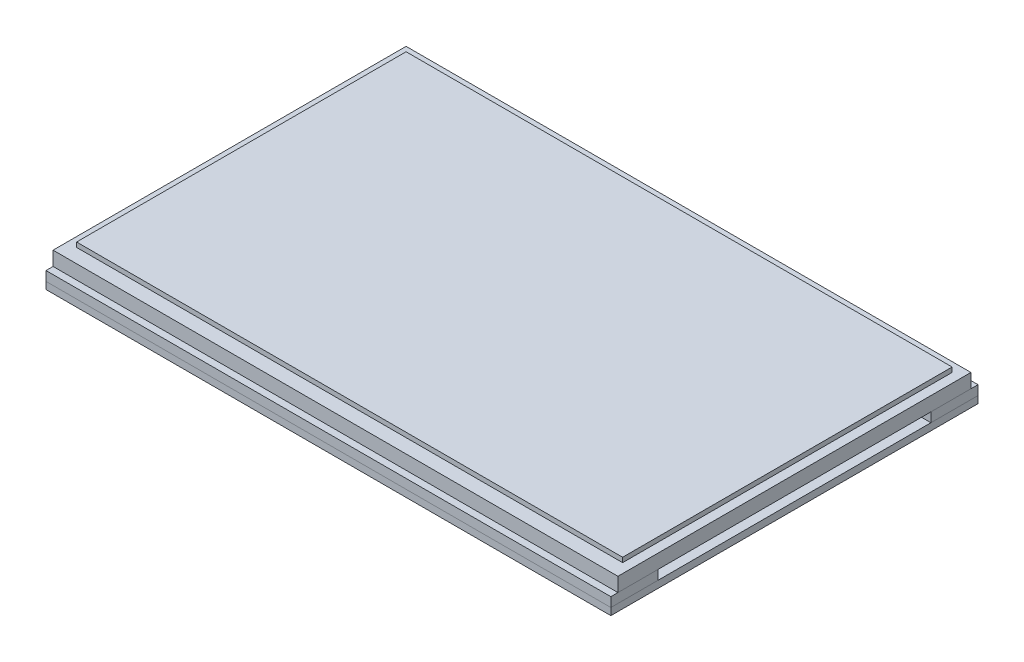
ISO-10303-21;
HEADER;
FILE_DESCRIPTION(('STEP AP214'),'2;1');
FILE_NAME('part.step','',(''),(''),'','','');
FILE_SCHEMA(('AUTOMOTIVE_DESIGN { 1 0 10303 214 1 1 1 1 }'));
ENDSEC;
DATA;
#1=APPLICATION_CONTEXT('core data for automotive mechanical design processes');
#2=APPLICATION_PROTOCOL_DEFINITION('international standard','automotive_design',2000,#1);
#3=PRODUCT_CONTEXT('',#1,'mechanical');
#4=PRODUCT('Part','Part','',(#3));
#5=PRODUCT_RELATED_PRODUCT_CATEGORY('part','',(#4));
#6=PRODUCT_DEFINITION_FORMATION('','',#4);
#7=PRODUCT_DEFINITION_CONTEXT('part definition',#1,'design');
#8=PRODUCT_DEFINITION('design','',#6,#7);
#9=PRODUCT_DEFINITION_SHAPE('','',#8);
#10=(LENGTH_UNIT() NAMED_UNIT(*) SI_UNIT(.MILLI.,.METRE.));
#11=(NAMED_UNIT(*) PLANE_ANGLE_UNIT() SI_UNIT($,.RADIAN.));
#12=(NAMED_UNIT(*) SI_UNIT($,.STERADIAN.) SOLID_ANGLE_UNIT());
#13=UNCERTAINTY_MEASURE_WITH_UNIT(LENGTH_MEASURE(1.E-05),#10,'distance_accuracy_value','');
#14=(GEOMETRIC_REPRESENTATION_CONTEXT(3) GLOBAL_UNCERTAINTY_ASSIGNED_CONTEXT((#13)) GLOBAL_UNIT_ASSIGNED_CONTEXT((#10,
#11,#12)) REPRESENTATION_CONTEXT('',''));
#15=CARTESIAN_POINT('',(0.,0.,0.));
#16=DIRECTION('',(0.,0.,1.));
#17=DIRECTION('',(1.,0.,0.));
#18=AXIS2_PLACEMENT_3D('',#15,#16,#17);
#19=CARTESIAN_POINT('',(-8.87339826388611,54.1494730588934,67.3928000621272));
#20=DIRECTION('',(1.,0.,0.));
#21=DIRECTION('',(0.,0.,-1.));
#22=AXIS2_PLACEMENT_3D('',#19,#20,#21);
#23=PLANE('',#22);
#24=DIRECTION('',(0.,0.,1.));
#25=VECTOR('',#24,1.);
#26=CARTESIAN_POINT('',(-8.87339826388611,52.1494730588934,67.3928000621272));
#27=LINE('',#26,#25);
#28=CARTESIAN_POINT('',(-8.87339826388611,52.1494730588934,57.3928000621272));
#29=VERTEX_POINT('',#28);
#30=CARTESIAN_POINT('',(-8.87339826388611,52.1494730588934,67.3928000621272));
#31=VERTEX_POINT('',#30);
#32=EDGE_CURVE('P0_E80',#29,#31,#27,.T.);
#33=ORIENTED_EDGE('',*,*,#32,.T.);
#34=DIRECTION('',(0.,-1.,0.));
#35=VECTOR('',#34,1.);
#36=CARTESIAN_POINT('',(-8.87339826388611,54.1494730588934,67.3928000621272));
#37=LINE('',#36,#35);
#38=CARTESIAN_POINT('',(-8.87339826388611,54.1494730588934,67.3928000621272));
#39=VERTEX_POINT('',#38);
#40=EDGE_CURVE('P0_E11',#39,#31,#37,.T.);
#41=ORIENTED_EDGE('',*,*,#40,.F.);
#42=DIRECTION('',(0.,0.,1.));
#43=VECTOR('',#42,1.);
#44=CARTESIAN_POINT('',(-8.87339826388611,54.1494730588934,67.3928000621272));
#45=LINE('',#44,#43);
#46=CARTESIAN_POINT('',(-8.87339826388611,54.1494730588934,57.3928000621272));
#47=VERTEX_POINT('',#46);
#48=EDGE_CURVE('P0_E68',#47,#39,#45,.T.);
#49=ORIENTED_EDGE('',*,*,#48,.F.);
#50=DIRECTION('',(0.,-1.,0.));
#51=VECTOR('',#50,1.);
#52=CARTESIAN_POINT('',(-8.87339826388611,54.1494730588934,57.3928000621272));
#53=LINE('',#52,#51);
#54=EDGE_CURVE('P0_E76',#47,#29,#53,.T.);
#55=ORIENTED_EDGE('',*,*,#54,.T.);
#56=EDGE_LOOP('',(#33,#41,#49,#55));
#57=FACE_BOUND('',#56,.T.);
#58=ADVANCED_FACE('P0_F17',(#57),#23,.F.);
#59=CARTESIAN_POINT('',(-8.87339826388611,54.1494730588934,67.3928000621272));
#60=DIRECTION('',(0.,0.,-1.));
#61=DIRECTION('',(-1.,0.,0.));
#62=AXIS2_PLACEMENT_3D('',#59,#60,#61);
#63=PLANE('',#62);
#64=DIRECTION('',(1.,0.,0.));
#65=VECTOR('',#64,1.);
#66=CARTESIAN_POINT('',(-8.87339826388611,52.1494730588934,67.3928000621272));
#67=LINE('',#66,#65);
#68=CARTESIAN_POINT('',(111.126601736114,52.1494730588934,67.3928000621272));
#69=VERTEX_POINT('',#68);
#70=EDGE_CURVE('P0_E72',#31,#69,#67,.T.);
#71=ORIENTED_EDGE('',*,*,#70,.T.);
#72=DIRECTION('',(0.,-1.,0.));
#73=VECTOR('',#72,1.);
#74=CARTESIAN_POINT('',(111.126601736114,54.1494730588934,67.3928000621272));
#75=LINE('',#74,#73);
#76=CARTESIAN_POINT('',(111.126601736114,54.1494730588934,67.3928000621272));
#77=VERTEX_POINT('',#76);
#78=EDGE_CURVE('P0_E25',#77,#69,#75,.T.);
#79=ORIENTED_EDGE('',*,*,#78,.F.);
#80=DIRECTION('',(1.,0.,0.));
#81=VECTOR('',#80,1.);
#82=CARTESIAN_POINT('',(-8.87339826388611,54.1494730588934,67.3928000621272));
#83=LINE('',#82,#81);
#84=EDGE_CURVE('P0_E63',#39,#77,#83,.T.);
#85=ORIENTED_EDGE('',*,*,#84,.F.);
#86=ORIENTED_EDGE('',*,*,#40,.T.);
#87=EDGE_LOOP('',(#71,#79,#85,#86));
#88=FACE_BOUND('',#87,.T.);
#89=ADVANCED_FACE('P0_F71',(#88),#63,.F.);
#90=CARTESIAN_POINT('',(111.126601736114,54.1494730588934,67.3928000621272));
#91=DIRECTION('',(-1.,0.,0.));
#92=DIRECTION('',(0.,0.,1.));
#93=AXIS2_PLACEMENT_3D('',#90,#91,#92);
#94=PLANE('',#93);
#95=DIRECTION('',(0.,0.,-1.));
#96=VECTOR('',#95,1.);
#97=CARTESIAN_POINT('',(111.126601736114,52.1494730588934,67.3928000621272));
#98=LINE('',#97,#96);
#99=CARTESIAN_POINT('',(111.126601736114,52.1494730588934,57.3928000621272));
#100=VERTEX_POINT('',#99);
#101=EDGE_CURVE('P0_E50',#69,#100,#98,.T.);
#102=ORIENTED_EDGE('',*,*,#101,.T.);
#103=DIRECTION('',(0.,-1.,0.));
#104=VECTOR('',#103,1.);
#105=CARTESIAN_POINT('',(111.126601736114,54.1494730588934,57.3928000621272));
#106=LINE('',#105,#104);
#107=CARTESIAN_POINT('',(111.126601736114,54.1494730588934,57.3928000621272));
#108=VERTEX_POINT('',#107);
#109=EDGE_CURVE('P0_E73',#108,#100,#106,.T.);
#110=ORIENTED_EDGE('',*,*,#109,.F.);
#111=DIRECTION('',(0.,0.,-1.));
#112=VECTOR('',#111,1.);
#113=CARTESIAN_POINT('',(111.126601736114,54.1494730588934,67.3928000621272));
#114=LINE('',#113,#112);
#115=EDGE_CURVE('P0_E66',#77,#108,#114,.T.);
#116=ORIENTED_EDGE('',*,*,#115,.F.);
#117=ORIENTED_EDGE('',*,*,#78,.T.);
#118=EDGE_LOOP('',(#102,#110,#116,#117));
#119=FACE_BOUND('',#118,.T.);
#120=ADVANCED_FACE('P0_F74',(#119),#94,.F.);
#121=CARTESIAN_POINT('',(-8.87339826388611,54.1494730588934,57.3928000621272));
#122=DIRECTION('',(0.,0.,1.));
#123=DIRECTION('',(1.,0.,0.));
#124=AXIS2_PLACEMENT_3D('',#121,#122,#123);
#125=PLANE('',#124);
#126=DIRECTION('',(-1.,0.,0.));
#127=VECTOR('',#126,1.);
#128=CARTESIAN_POINT('',(-8.87339826388611,52.1494730588934,57.3928000621272));
#129=LINE('',#128,#127);
#130=EDGE_CURVE('P0_E56',#100,#29,#129,.T.);
#131=ORIENTED_EDGE('',*,*,#130,.T.);
#132=ORIENTED_EDGE('',*,*,#54,.F.);
#133=DIRECTION('',(-1.,0.,0.));
#134=VECTOR('',#133,1.);
#135=CARTESIAN_POINT('',(-8.87339826388611,54.1494730588934,57.3928000621272));
#136=LINE('',#135,#134);
#137=EDGE_CURVE('P0_E33',#108,#47,#136,.T.);
#138=ORIENTED_EDGE('',*,*,#137,.F.);
#139=ORIENTED_EDGE('',*,*,#109,.T.);
#140=EDGE_LOOP('',(#131,#132,#138,#139));
#141=FACE_BOUND('',#140,.T.);
#142=ADVANCED_FACE('P0_F87',(#141),#125,.F.);
#143=CARTESIAN_POINT('',(-8.87339826388611,54.1494730588934,67.3928000621272));
#144=DIRECTION('',(0.,-1.,0.));
#145=DIRECTION('',(0.,0.,-1.));
#146=AXIS2_PLACEMENT_3D('',#143,#144,#145);
#147=PLANE('',#146);
#148=ORIENTED_EDGE('',*,*,#48,.T.);
#149=ORIENTED_EDGE('',*,*,#84,.T.);
#150=ORIENTED_EDGE('',*,*,#115,.T.);
#151=ORIENTED_EDGE('',*,*,#137,.T.);
#152=EDGE_LOOP('',(#148,#149,#150,#151));
#153=FACE_BOUND('',#152,.T.);
#154=ADVANCED_FACE('P0_F64',(#153),#147,.F.);
#155=CARTESIAN_POINT('',(-8.87339826388611,52.1494730588934,67.3928000621272));
#156=DIRECTION('',(0.,-1.,0.));
#157=DIRECTION('',(0.,0.,-1.));
#158=AXIS2_PLACEMENT_3D('',#155,#156,#157);
#159=PLANE('',#158);
#160=ORIENTED_EDGE('',*,*,#32,.F.);
#161=ORIENTED_EDGE('',*,*,#130,.F.);
#162=ORIENTED_EDGE('',*,*,#101,.F.);
#163=ORIENTED_EDGE('',*,*,#70,.F.);
#164=EDGE_LOOP('',(#160,#161,#162,#163));
#165=FACE_BOUND('',#164,.T.);
#166=ADVANCED_FACE('P0_F90',(#165),#159,.T.);
#167=CLOSED_SHELL('',(#58,#89,#120,#142,#154,#166));
#168=MANIFOLD_SOLID_BREP('P0_B1',#167);
#169=CARTESIAN_POINT('',(-8.87339826388611,54.1494730588934,135.392800062127));
#170=DIRECTION('',(1.,0.,0.));
#171=DIRECTION('',(0.,0.,-1.));
#172=AXIS2_PLACEMENT_3D('',#169,#170,#171);
#173=PLANE('',#172);
#174=DIRECTION('',(0.,0.,1.));
#175=VECTOR('',#174,1.);
#176=CARTESIAN_POINT('',(-8.87339826388611,52.1494730588934,135.392800062127));
#177=LINE('',#176,#175);
#178=CARTESIAN_POINT('',(-8.87339826388611,52.1494730588934,125.392800062127));
#179=VERTEX_POINT('',#178);
#180=CARTESIAN_POINT('',(-8.87339826388611,52.1494730588934,135.392800062127));
#181=VERTEX_POINT('',#180);
#182=EDGE_CURVE('P1_E80',#179,#181,#177,.T.);
#183=ORIENTED_EDGE('',*,*,#182,.T.);
#184=DIRECTION('',(0.,-1.,0.));
#185=VECTOR('',#184,1.);
#186=CARTESIAN_POINT('',(-8.87339826388611,54.1494730588934,135.392800062127));
#187=LINE('',#186,#185);
#188=CARTESIAN_POINT('',(-8.87339826388611,54.1494730588934,135.392800062127));
#189=VERTEX_POINT('',#188);
#190=EDGE_CURVE('P1_E11',#189,#181,#187,.T.);
#191=ORIENTED_EDGE('',*,*,#190,.F.);
#192=DIRECTION('',(0.,0.,1.));
#193=VECTOR('',#192,1.);
#194=CARTESIAN_POINT('',(-8.87339826388611,54.1494730588934,135.392800062127));
#195=LINE('',#194,#193);
#196=CARTESIAN_POINT('',(-8.87339826388611,54.1494730588934,125.392800062127));
#197=VERTEX_POINT('',#196);
#198=EDGE_CURVE('P1_E68',#197,#189,#195,.T.);
#199=ORIENTED_EDGE('',*,*,#198,.F.);
#200=DIRECTION('',(0.,-1.,0.));
#201=VECTOR('',#200,1.);
#202=CARTESIAN_POINT('',(-8.87339826388611,54.1494730588934,125.392800062127));
#203=LINE('',#202,#201);
#204=EDGE_CURVE('P1_E76',#197,#179,#203,.T.);
#205=ORIENTED_EDGE('',*,*,#204,.T.);
#206=EDGE_LOOP('',(#183,#191,#199,#205));
#207=FACE_BOUND('',#206,.T.);
#208=ADVANCED_FACE('P1_F17',(#207),#173,.F.);
#209=CARTESIAN_POINT('',(-8.87339826388611,54.1494730588934,135.392800062127));
#210=DIRECTION('',(0.,0.,-1.));
#211=DIRECTION('',(-1.,0.,0.));
#212=AXIS2_PLACEMENT_3D('',#209,#210,#211);
#213=PLANE('',#212);
#214=DIRECTION('',(1.,0.,0.));
#215=VECTOR('',#214,1.);
#216=CARTESIAN_POINT('',(-8.87339826388611,52.1494730588934,135.392800062127));
#217=LINE('',#216,#215);
#218=CARTESIAN_POINT('',(111.126601736114,52.1494730588934,135.392800062127));
#219=VERTEX_POINT('',#218);
#220=EDGE_CURVE('P1_E72',#181,#219,#217,.T.);
#221=ORIENTED_EDGE('',*,*,#220,.T.);
#222=DIRECTION('',(0.,-1.,0.));
#223=VECTOR('',#222,1.);
#224=CARTESIAN_POINT('',(111.126601736114,54.1494730588934,135.392800062127));
#225=LINE('',#224,#223);
#226=CARTESIAN_POINT('',(111.126601736114,54.1494730588934,135.392800062127));
#227=VERTEX_POINT('',#226);
#228=EDGE_CURVE('P1_E25',#227,#219,#225,.T.);
#229=ORIENTED_EDGE('',*,*,#228,.F.);
#230=DIRECTION('',(1.,0.,0.));
#231=VECTOR('',#230,1.);
#232=CARTESIAN_POINT('',(-8.87339826388611,54.1494730588934,135.392800062127));
#233=LINE('',#232,#231);
#234=EDGE_CURVE('P1_E63',#189,#227,#233,.T.);
#235=ORIENTED_EDGE('',*,*,#234,.F.);
#236=ORIENTED_EDGE('',*,*,#190,.T.);
#237=EDGE_LOOP('',(#221,#229,#235,#236));
#238=FACE_BOUND('',#237,.T.);
#239=ADVANCED_FACE('P1_F71',(#238),#213,.F.);
#240=CARTESIAN_POINT('',(111.126601736114,54.1494730588934,135.392800062127));
#241=DIRECTION('',(-1.,0.,0.));
#242=DIRECTION('',(0.,0.,1.));
#243=AXIS2_PLACEMENT_3D('',#240,#241,#242);
#244=PLANE('',#243);
#245=DIRECTION('',(0.,0.,-1.));
#246=VECTOR('',#245,1.);
#247=CARTESIAN_POINT('',(111.126601736114,52.1494730588934,135.392800062127));
#248=LINE('',#247,#246);
#249=CARTESIAN_POINT('',(111.126601736114,52.1494730588934,125.392800062127));
#250=VERTEX_POINT('',#249);
#251=EDGE_CURVE('P1_E50',#219,#250,#248,.T.);
#252=ORIENTED_EDGE('',*,*,#251,.T.);
#253=DIRECTION('',(0.,-1.,0.));
#254=VECTOR('',#253,1.);
#255=CARTESIAN_POINT('',(111.126601736114,54.1494730588934,125.392800062127));
#256=LINE('',#255,#254);
#257=CARTESIAN_POINT('',(111.126601736114,54.1494730588934,125.392800062127));
#258=VERTEX_POINT('',#257);
#259=EDGE_CURVE('P1_E73',#258,#250,#256,.T.);
#260=ORIENTED_EDGE('',*,*,#259,.F.);
#261=DIRECTION('',(0.,0.,-1.));
#262=VECTOR('',#261,1.);
#263=CARTESIAN_POINT('',(111.126601736114,54.1494730588934,135.392800062127));
#264=LINE('',#263,#262);
#265=EDGE_CURVE('P1_E66',#227,#258,#264,.T.);
#266=ORIENTED_EDGE('',*,*,#265,.F.);
#267=ORIENTED_EDGE('',*,*,#228,.T.);
#268=EDGE_LOOP('',(#252,#260,#266,#267));
#269=FACE_BOUND('',#268,.T.);
#270=ADVANCED_FACE('P1_F74',(#269),#244,.F.);
#271=CARTESIAN_POINT('',(-8.87339826388611,54.1494730588934,125.392800062127));
#272=DIRECTION('',(0.,0.,1.));
#273=DIRECTION('',(1.,0.,0.));
#274=AXIS2_PLACEMENT_3D('',#271,#272,#273);
#275=PLANE('',#274);
#276=DIRECTION('',(-1.,0.,0.));
#277=VECTOR('',#276,1.);
#278=CARTESIAN_POINT('',(-8.87339826388611,52.1494730588934,125.392800062127));
#279=LINE('',#278,#277);
#280=EDGE_CURVE('P1_E56',#250,#179,#279,.T.);
#281=ORIENTED_EDGE('',*,*,#280,.T.);
#282=ORIENTED_EDGE('',*,*,#204,.F.);
#283=DIRECTION('',(-1.,0.,0.));
#284=VECTOR('',#283,1.);
#285=CARTESIAN_POINT('',(-8.87339826388611,54.1494730588934,125.392800062127));
#286=LINE('',#285,#284);
#287=EDGE_CURVE('P1_E33',#258,#197,#286,.T.);
#288=ORIENTED_EDGE('',*,*,#287,.F.);
#289=ORIENTED_EDGE('',*,*,#259,.T.);
#290=EDGE_LOOP('',(#281,#282,#288,#289));
#291=FACE_BOUND('',#290,.T.);
#292=ADVANCED_FACE('P1_F87',(#291),#275,.F.);
#293=CARTESIAN_POINT('',(-8.87339826388611,54.1494730588934,135.392800062127));
#294=DIRECTION('',(0.,-1.,0.));
#295=DIRECTION('',(0.,0.,-1.));
#296=AXIS2_PLACEMENT_3D('',#293,#294,#295);
#297=PLANE('',#296);
#298=ORIENTED_EDGE('',*,*,#198,.T.);
#299=ORIENTED_EDGE('',*,*,#234,.T.);
#300=ORIENTED_EDGE('',*,*,#265,.T.);
#301=ORIENTED_EDGE('',*,*,#287,.T.);
#302=EDGE_LOOP('',(#298,#299,#300,#301));
#303=FACE_BOUND('',#302,.T.);
#304=ADVANCED_FACE('P1_F64',(#303),#297,.F.);
#305=CARTESIAN_POINT('',(-8.87339826388611,52.1494730588934,135.392800062127));
#306=DIRECTION('',(0.,-1.,0.));
#307=DIRECTION('',(0.,0.,-1.));
#308=AXIS2_PLACEMENT_3D('',#305,#306,#307);
#309=PLANE('',#308);
#310=ORIENTED_EDGE('',*,*,#182,.F.);
#311=ORIENTED_EDGE('',*,*,#280,.F.);
#312=ORIENTED_EDGE('',*,*,#251,.F.);
#313=ORIENTED_EDGE('',*,*,#220,.F.);
#314=EDGE_LOOP('',(#310,#311,#312,#313));
#315=FACE_BOUND('',#314,.T.);
#316=ADVANCED_FACE('P1_F90',(#315),#309,.T.);
#317=CLOSED_SHELL('',(#208,#239,#270,#292,#304,#316));
#318=MANIFOLD_SOLID_BREP('P1_B1',#317);
#319=CARTESIAN_POINT('',(-8.87339826388611,52.1494730588934,135.392800062127));
#320=DIRECTION('',(1.,0.,0.));
#321=DIRECTION('',(0.,0.,-1.));
#322=AXIS2_PLACEMENT_3D('',#319,#320,#321);
#323=PLANE('',#322);
#324=DIRECTION('',(0.,0.,1.));
#325=VECTOR('',#324,1.);
#326=CARTESIAN_POINT('',(-8.87339826388611,50.6494730588934,135.392800062127));
#327=LINE('',#326,#325);
#328=CARTESIAN_POINT('',(-8.87339826388611,50.6494730588934,57.3928000621272));
#329=VERTEX_POINT('',#328);
#330=CARTESIAN_POINT('',(-8.87339826388611,50.6494730588934,135.392800062127));
#331=VERTEX_POINT('',#330);
#332=EDGE_CURVE('P2_E80',#329,#331,#327,.T.);
#333=ORIENTED_EDGE('',*,*,#332,.T.);
#334=DIRECTION('',(0.,-1.,0.));
#335=VECTOR('',#334,1.);
#336=CARTESIAN_POINT('',(-8.87339826388611,52.1494730588934,135.392800062127));
#337=LINE('',#336,#335);
#338=CARTESIAN_POINT('',(-8.87339826388611,52.1494730588934,135.392800062127));
#339=VERTEX_POINT('',#338);
#340=EDGE_CURVE('P2_E11',#339,#331,#337,.T.);
#341=ORIENTED_EDGE('',*,*,#340,.F.);
#342=DIRECTION('',(0.,0.,1.));
#343=VECTOR('',#342,1.);
#344=CARTESIAN_POINT('',(-8.87339826388611,52.1494730588934,135.392800062127));
#345=LINE('',#344,#343);
#346=CARTESIAN_POINT('',(-8.87339826388611,52.1494730588934,57.3928000621272));
#347=VERTEX_POINT('',#346);
#348=EDGE_CURVE('P2_E68',#347,#339,#345,.T.);
#349=ORIENTED_EDGE('',*,*,#348,.F.);
#350=DIRECTION('',(0.,-1.,0.));
#351=VECTOR('',#350,1.);
#352=CARTESIAN_POINT('',(-8.87339826388611,52.1494730588934,57.3928000621272));
#353=LINE('',#352,#351);
#354=EDGE_CURVE('P2_E76',#347,#329,#353,.T.);
#355=ORIENTED_EDGE('',*,*,#354,.T.);
#356=EDGE_LOOP('',(#333,#341,#349,#355));
#357=FACE_BOUND('',#356,.T.);
#358=ADVANCED_FACE('P2_F17',(#357),#323,.F.);
#359=CARTESIAN_POINT('',(-8.87339826388611,52.1494730588934,135.392800062127));
#360=DIRECTION('',(0.,0.,-1.));
#361=DIRECTION('',(-1.,0.,0.));
#362=AXIS2_PLACEMENT_3D('',#359,#360,#361);
#363=PLANE('',#362);
#364=DIRECTION('',(1.,0.,0.));
#365=VECTOR('',#364,1.);
#366=CARTESIAN_POINT('',(-8.87339826388611,50.6494730588934,135.392800062127));
#367=LINE('',#366,#365);
#368=CARTESIAN_POINT('',(111.126601736114,50.6494730588934,135.392800062127));
#369=VERTEX_POINT('',#368);
#370=EDGE_CURVE('P2_E72',#331,#369,#367,.T.);
#371=ORIENTED_EDGE('',*,*,#370,.T.);
#372=DIRECTION('',(0.,-1.,0.));
#373=VECTOR('',#372,1.);
#374=CARTESIAN_POINT('',(111.126601736114,52.1494730588934,135.392800062127));
#375=LINE('',#374,#373);
#376=CARTESIAN_POINT('',(111.126601736114,52.1494730588934,135.392800062127));
#377=VERTEX_POINT('',#376);
#378=EDGE_CURVE('P2_E25',#377,#369,#375,.T.);
#379=ORIENTED_EDGE('',*,*,#378,.F.);
#380=DIRECTION('',(1.,0.,0.));
#381=VECTOR('',#380,1.);
#382=CARTESIAN_POINT('',(-8.87339826388611,52.1494730588934,135.392800062127));
#383=LINE('',#382,#381);
#384=EDGE_CURVE('P2_E63',#339,#377,#383,.T.);
#385=ORIENTED_EDGE('',*,*,#384,.F.);
#386=ORIENTED_EDGE('',*,*,#340,.T.);
#387=EDGE_LOOP('',(#371,#379,#385,#386));
#388=FACE_BOUND('',#387,.T.);
#389=ADVANCED_FACE('P2_F71',(#388),#363,.F.);
#390=CARTESIAN_POINT('',(111.126601736114,52.1494730588934,135.392800062127));
#391=DIRECTION('',(-1.,0.,0.));
#392=DIRECTION('',(0.,0.,1.));
#393=AXIS2_PLACEMENT_3D('',#390,#391,#392);
#394=PLANE('',#393);
#395=DIRECTION('',(0.,0.,-1.));
#396=VECTOR('',#395,1.);
#397=CARTESIAN_POINT('',(111.126601736114,50.6494730588934,135.392800062127));
#398=LINE('',#397,#396);
#399=CARTESIAN_POINT('',(111.126601736114,50.6494730588934,57.3928000621272));
#400=VERTEX_POINT('',#399);
#401=EDGE_CURVE('P2_E50',#369,#400,#398,.T.);
#402=ORIENTED_EDGE('',*,*,#401,.T.);
#403=DIRECTION('',(0.,-1.,0.));
#404=VECTOR('',#403,1.);
#405=CARTESIAN_POINT('',(111.126601736114,52.1494730588934,57.3928000621272));
#406=LINE('',#405,#404);
#407=CARTESIAN_POINT('',(111.126601736114,52.1494730588934,57.3928000621272));
#408=VERTEX_POINT('',#407);
#409=EDGE_CURVE('P2_E73',#408,#400,#406,.T.);
#410=ORIENTED_EDGE('',*,*,#409,.F.);
#411=DIRECTION('',(0.,0.,-1.));
#412=VECTOR('',#411,1.);
#413=CARTESIAN_POINT('',(111.126601736114,52.1494730588934,135.392800062127));
#414=LINE('',#413,#412);
#415=EDGE_CURVE('P2_E66',#377,#408,#414,.T.);
#416=ORIENTED_EDGE('',*,*,#415,.F.);
#417=ORIENTED_EDGE('',*,*,#378,.T.);
#418=EDGE_LOOP('',(#402,#410,#416,#417));
#419=FACE_BOUND('',#418,.T.);
#420=ADVANCED_FACE('P2_F74',(#419),#394,.F.);
#421=CARTESIAN_POINT('',(-8.87339826388611,52.1494730588934,57.3928000621272));
#422=DIRECTION('',(0.,0.,1.));
#423=DIRECTION('',(1.,0.,0.));
#424=AXIS2_PLACEMENT_3D('',#421,#422,#423);
#425=PLANE('',#424);
#426=DIRECTION('',(-1.,0.,0.));
#427=VECTOR('',#426,1.);
#428=CARTESIAN_POINT('',(-8.87339826388611,50.6494730588934,57.3928000621272));
#429=LINE('',#428,#427);
#430=EDGE_CURVE('P2_E56',#400,#329,#429,.T.);
#431=ORIENTED_EDGE('',*,*,#430,.T.);
#432=ORIENTED_EDGE('',*,*,#354,.F.);
#433=DIRECTION('',(-1.,0.,0.));
#434=VECTOR('',#433,1.);
#435=CARTESIAN_POINT('',(-8.87339826388611,52.1494730588934,57.3928000621272));
#436=LINE('',#435,#434);
#437=EDGE_CURVE('P2_E33',#408,#347,#436,.T.);
#438=ORIENTED_EDGE('',*,*,#437,.F.);
#439=ORIENTED_EDGE('',*,*,#409,.T.);
#440=EDGE_LOOP('',(#431,#432,#438,#439));
#441=FACE_BOUND('',#440,.T.);
#442=ADVANCED_FACE('P2_F87',(#441),#425,.F.);
#443=CARTESIAN_POINT('',(-8.87339826388611,52.1494730588934,135.392800062127));
#444=DIRECTION('',(0.,-1.,0.));
#445=DIRECTION('',(0.,0.,-1.));
#446=AXIS2_PLACEMENT_3D('',#443,#444,#445);
#447=PLANE('',#446);
#448=ORIENTED_EDGE('',*,*,#348,.T.);
#449=ORIENTED_EDGE('',*,*,#384,.T.);
#450=ORIENTED_EDGE('',*,*,#415,.T.);
#451=ORIENTED_EDGE('',*,*,#437,.T.);
#452=EDGE_LOOP('',(#448,#449,#450,#451));
#453=FACE_BOUND('',#452,.T.);
#454=ADVANCED_FACE('P2_F64',(#453),#447,.F.);
#455=CARTESIAN_POINT('',(-8.87339826388611,50.6494730588934,135.392800062127));
#456=DIRECTION('',(0.,-1.,0.));
#457=DIRECTION('',(0.,0.,-1.));
#458=AXIS2_PLACEMENT_3D('',#455,#456,#457);
#459=PLANE('',#458);
#460=ORIENTED_EDGE('',*,*,#332,.F.);
#461=ORIENTED_EDGE('',*,*,#430,.F.);
#462=ORIENTED_EDGE('',*,*,#401,.F.);
#463=ORIENTED_EDGE('',*,*,#370,.F.);
#464=EDGE_LOOP('',(#460,#461,#462,#463));
#465=FACE_BOUND('',#464,.T.);
#466=ADVANCED_FACE('P2_F90',(#465),#459,.T.);
#467=CLOSED_SHELL('',(#358,#389,#420,#442,#454,#466));
#468=MANIFOLD_SOLID_BREP('P2_B1',#467);
#469=CARTESIAN_POINT('',(-8.87339826388611,57.1494730588934,133.892800062127));
#470=DIRECTION('',(1.,0.,0.));
#471=DIRECTION('',(0.,0.,-1.));
#472=AXIS2_PLACEMENT_3D('',#469,#470,#471);
#473=PLANE('',#472);
#474=DIRECTION('',(0.,0.,1.));
#475=VECTOR('',#474,1.);
#476=CARTESIAN_POINT('',(-8.87339826388611,54.1494730588934,133.892800062127));
#477=LINE('',#476,#475);
#478=CARTESIAN_POINT('',(-8.87339826388611,54.1494730588934,58.8928000621272));
#479=VERTEX_POINT('',#478);
#480=CARTESIAN_POINT('',(-8.87339826388611,54.1494730588934,133.892800062127));
#481=VERTEX_POINT('',#480);
#482=EDGE_CURVE('P3_E80',#479,#481,#477,.T.);
#483=ORIENTED_EDGE('',*,*,#482,.T.);
#484=DIRECTION('',(0.,-1.,0.));
#485=VECTOR('',#484,1.);
#486=CARTESIAN_POINT('',(-8.87339826388611,57.1494730588934,133.892800062127));
#487=LINE('',#486,#485);
#488=CARTESIAN_POINT('',(-8.87339826388611,57.1494730588934,133.892800062127));
#489=VERTEX_POINT('',#488);
#490=EDGE_CURVE('P3_E11',#489,#481,#487,.T.);
#491=ORIENTED_EDGE('',*,*,#490,.F.);
#492=DIRECTION('',(0.,0.,1.));
#493=VECTOR('',#492,1.);
#494=CARTESIAN_POINT('',(-8.87339826388611,57.1494730588934,133.892800062127));
#495=LINE('',#494,#493);
#496=CARTESIAN_POINT('',(-8.87339826388611,57.1494730588934,58.8928000621272));
#497=VERTEX_POINT('',#496);
#498=EDGE_CURVE('P3_E68',#497,#489,#495,.T.);
#499=ORIENTED_EDGE('',*,*,#498,.F.);
#500=DIRECTION('',(0.,-1.,0.));
#501=VECTOR('',#500,1.);
#502=CARTESIAN_POINT('',(-8.87339826388611,57.1494730588934,58.8928000621272));
#503=LINE('',#502,#501);
#504=EDGE_CURVE('P3_E76',#497,#479,#503,.T.);
#505=ORIENTED_EDGE('',*,*,#504,.T.);
#506=EDGE_LOOP('',(#483,#491,#499,#505));
#507=FACE_BOUND('',#506,.T.);
#508=ADVANCED_FACE('P3_F17',(#507),#473,.F.);
#509=CARTESIAN_POINT('',(-8.87339826388611,57.1494730588934,133.892800062127));
#510=DIRECTION('',(0.,0.,-1.));
#511=DIRECTION('',(-1.,0.,0.));
#512=AXIS2_PLACEMENT_3D('',#509,#510,#511);
#513=PLANE('',#512);
#514=DIRECTION('',(1.,0.,0.));
#515=VECTOR('',#514,1.);
#516=CARTESIAN_POINT('',(-8.87339826388611,54.1494730588934,133.892800062127));
#517=LINE('',#516,#515);
#518=CARTESIAN_POINT('',(111.126601736114,54.1494730588934,133.892800062127));
#519=VERTEX_POINT('',#518);
#520=EDGE_CURVE('P3_E72',#481,#519,#517,.T.);
#521=ORIENTED_EDGE('',*,*,#520,.T.);
#522=DIRECTION('',(0.,-1.,0.));
#523=VECTOR('',#522,1.);
#524=CARTESIAN_POINT('',(111.126601736114,57.1494730588934,133.892800062127));
#525=LINE('',#524,#523);
#526=CARTESIAN_POINT('',(111.126601736114,57.1494730588934,133.892800062127));
#527=VERTEX_POINT('',#526);
#528=EDGE_CURVE('P3_E25',#527,#519,#525,.T.);
#529=ORIENTED_EDGE('',*,*,#528,.F.);
#530=DIRECTION('',(1.,0.,0.));
#531=VECTOR('',#530,1.);
#532=CARTESIAN_POINT('',(-8.87339826388611,57.1494730588934,133.892800062127));
#533=LINE('',#532,#531);
#534=EDGE_CURVE('P3_E63',#489,#527,#533,.T.);
#535=ORIENTED_EDGE('',*,*,#534,.F.);
#536=ORIENTED_EDGE('',*,*,#490,.T.);
#537=EDGE_LOOP('',(#521,#529,#535,#536));
#538=FACE_BOUND('',#537,.T.);
#539=ADVANCED_FACE('P3_F71',(#538),#513,.F.);
#540=CARTESIAN_POINT('',(111.126601736114,57.1494730588934,133.892800062127));
#541=DIRECTION('',(-1.,0.,0.));
#542=DIRECTION('',(0.,0.,1.));
#543=AXIS2_PLACEMENT_3D('',#540,#541,#542);
#544=PLANE('',#543);
#545=DIRECTION('',(0.,0.,-1.));
#546=VECTOR('',#545,1.);
#547=CARTESIAN_POINT('',(111.126601736114,54.1494730588934,133.892800062127));
#548=LINE('',#547,#546);
#549=CARTESIAN_POINT('',(111.126601736114,54.1494730588934,58.8928000621272));
#550=VERTEX_POINT('',#549);
#551=EDGE_CURVE('P3_E50',#519,#550,#548,.T.);
#552=ORIENTED_EDGE('',*,*,#551,.T.);
#553=DIRECTION('',(0.,-1.,0.));
#554=VECTOR('',#553,1.);
#555=CARTESIAN_POINT('',(111.126601736114,57.1494730588934,58.8928000621272));
#556=LINE('',#555,#554);
#557=CARTESIAN_POINT('',(111.126601736114,57.1494730588934,58.8928000621272));
#558=VERTEX_POINT('',#557);
#559=EDGE_CURVE('P3_E73',#558,#550,#556,.T.);
#560=ORIENTED_EDGE('',*,*,#559,.F.);
#561=DIRECTION('',(0.,0.,-1.));
#562=VECTOR('',#561,1.);
#563=CARTESIAN_POINT('',(111.126601736114,57.1494730588934,133.892800062127));
#564=LINE('',#563,#562);
#565=EDGE_CURVE('P3_E66',#527,#558,#564,.T.);
#566=ORIENTED_EDGE('',*,*,#565,.F.);
#567=ORIENTED_EDGE('',*,*,#528,.T.);
#568=EDGE_LOOP('',(#552,#560,#566,#567));
#569=FACE_BOUND('',#568,.T.);
#570=ADVANCED_FACE('P3_F74',(#569),#544,.F.);
#571=CARTESIAN_POINT('',(-8.87339826388611,57.1494730588934,58.8928000621272));
#572=DIRECTION('',(0.,0.,1.));
#573=DIRECTION('',(1.,0.,0.));
#574=AXIS2_PLACEMENT_3D('',#571,#572,#573);
#575=PLANE('',#574);
#576=DIRECTION('',(-1.,0.,0.));
#577=VECTOR('',#576,1.);
#578=CARTESIAN_POINT('',(-8.87339826388611,54.1494730588934,58.8928000621272));
#579=LINE('',#578,#577);
#580=EDGE_CURVE('P3_E56',#550,#479,#579,.T.);
#581=ORIENTED_EDGE('',*,*,#580,.T.);
#582=ORIENTED_EDGE('',*,*,#504,.F.);
#583=DIRECTION('',(-1.,0.,0.));
#584=VECTOR('',#583,1.);
#585=CARTESIAN_POINT('',(-8.87339826388611,57.1494730588934,58.8928000621272));
#586=LINE('',#585,#584);
#587=EDGE_CURVE('P3_E33',#558,#497,#586,.T.);
#588=ORIENTED_EDGE('',*,*,#587,.F.);
#589=ORIENTED_EDGE('',*,*,#559,.T.);
#590=EDGE_LOOP('',(#581,#582,#588,#589));
#591=FACE_BOUND('',#590,.T.);
#592=ADVANCED_FACE('P3_F87',(#591),#575,.F.);
#593=CARTESIAN_POINT('',(-8.87339826388611,57.1494730588934,133.892800062127));
#594=DIRECTION('',(0.,-1.,0.));
#595=DIRECTION('',(0.,0.,-1.));
#596=AXIS2_PLACEMENT_3D('',#593,#594,#595);
#597=PLANE('',#596);
#598=ORIENTED_EDGE('',*,*,#498,.T.);
#599=ORIENTED_EDGE('',*,*,#534,.T.);
#600=ORIENTED_EDGE('',*,*,#565,.T.);
#601=ORIENTED_EDGE('',*,*,#587,.T.);
#602=EDGE_LOOP('',(#598,#599,#600,#601));
#603=FACE_BOUND('',#602,.T.);
#604=ADVANCED_FACE('P3_F64',(#603),#597,.F.);
#605=CARTESIAN_POINT('',(-8.87339826388611,54.1494730588934,133.892800062127));
#606=DIRECTION('',(0.,-1.,0.));
#607=DIRECTION('',(0.,0.,-1.));
#608=AXIS2_PLACEMENT_3D('',#605,#606,#607);
#609=PLANE('',#608);
#610=ORIENTED_EDGE('',*,*,#482,.F.);
#611=ORIENTED_EDGE('',*,*,#580,.F.);
#612=ORIENTED_EDGE('',*,*,#551,.F.);
#613=ORIENTED_EDGE('',*,*,#520,.F.);
#614=EDGE_LOOP('',(#610,#611,#612,#613));
#615=FACE_BOUND('',#614,.T.);
#616=ADVANCED_FACE('P3_F90',(#615),#609,.T.);
#617=CLOSED_SHELL('',(#508,#539,#570,#592,#604,#616));
#618=MANIFOLD_SOLID_BREP('P3_B1',#617);
#619=CARTESIAN_POINT('',(-6.87339826388611,58.1494730588934,130.892800062127));
#620=DIRECTION('',(1.,0.,0.));
#621=DIRECTION('',(0.,0.,-1.));
#622=AXIS2_PLACEMENT_3D('',#619,#620,#621);
#623=PLANE('',#622);
#624=DIRECTION('',(0.,0.,1.));
#625=VECTOR('',#624,1.);
#626=CARTESIAN_POINT('',(-6.87339826388611,57.1494730588934,130.892800062127));
#627=LINE('',#626,#625);
#628=CARTESIAN_POINT('',(-6.87339826388611,57.1494730588934,60.8928000621272));
#629=VERTEX_POINT('',#628);
#630=CARTESIAN_POINT('',(-6.87339826388611,57.1494730588934,130.892800062127));
#631=VERTEX_POINT('',#630);
#632=EDGE_CURVE('P4_E79',#629,#631,#627,.T.);
#633=ORIENTED_EDGE('',*,*,#632,.T.);
#634=DIRECTION('',(0.,-1.,0.));
#635=VECTOR('',#634,1.);
#636=CARTESIAN_POINT('',(-6.87339826388611,58.1494730588934,130.892800062127));
#637=LINE('',#636,#635);
#638=CARTESIAN_POINT('',(-6.87339826388611,58.1494730588934,130.892800062127));
#639=VERTEX_POINT('',#638);
#640=EDGE_CURVE('P4_E10',#639,#631,#637,.T.);
#641=ORIENTED_EDGE('',*,*,#640,.F.);
#642=DIRECTION('',(0.,0.,1.));
#643=VECTOR('',#642,1.);
#644=CARTESIAN_POINT('',(-6.87339826388611,58.1494730588934,130.892800062127));
#645=LINE('',#644,#643);
#646=CARTESIAN_POINT('',(-6.87339826388611,58.1494730588934,60.8928000621272));
#647=VERTEX_POINT('',#646);
#648=EDGE_CURVE('P4_E67',#647,#639,#645,.T.);
#649=ORIENTED_EDGE('',*,*,#648,.F.);
#650=DIRECTION('',(0.,-1.,0.));
#651=VECTOR('',#650,1.);
#652=CARTESIAN_POINT('',(-6.87339826388611,58.1494730588934,60.8928000621272));
#653=LINE('',#652,#651);
#654=EDGE_CURVE('P4_E75',#647,#629,#653,.T.);
#655=ORIENTED_EDGE('',*,*,#654,.T.);
#656=EDGE_LOOP('',(#633,#641,#649,#655));
#657=FACE_BOUND('',#656,.T.);
#658=ADVANCED_FACE('P4_F16',(#657),#623,.F.);
#659=CARTESIAN_POINT('',(-6.87339826388611,58.1494730588934,130.892800062127));
#660=DIRECTION('',(0.,0.,-1.));
#661=DIRECTION('',(-1.,0.,0.));
#662=AXIS2_PLACEMENT_3D('',#659,#660,#661);
#663=PLANE('',#662);
#664=DIRECTION('',(1.,0.,0.));
#665=VECTOR('',#664,1.);
#666=CARTESIAN_POINT('',(-6.87339826388611,57.1494730588934,130.892800062127));
#667=LINE('',#666,#665);
#668=CARTESIAN_POINT('',(109.126601736114,57.1494730588934,130.892800062127));
#669=VERTEX_POINT('',#668);
#670=EDGE_CURVE('P4_E71',#631,#669,#667,.T.);
#671=ORIENTED_EDGE('',*,*,#670,.T.);
#672=DIRECTION('',(0.,-1.,0.));
#673=VECTOR('',#672,1.);
#674=CARTESIAN_POINT('',(109.126601736114,58.1494730588934,130.892800062127));
#675=LINE('',#674,#673);
#676=CARTESIAN_POINT('',(109.126601736114,58.1494730588934,130.892800062127));
#677=VERTEX_POINT('',#676);
#678=EDGE_CURVE('P4_E24',#677,#669,#675,.T.);
#679=ORIENTED_EDGE('',*,*,#678,.F.);
#680=DIRECTION('',(1.,0.,0.));
#681=VECTOR('',#680,1.);
#682=CARTESIAN_POINT('',(-6.87339826388611,58.1494730588934,130.892800062127));
#683=LINE('',#682,#681);
#684=EDGE_CURVE('P4_E62',#639,#677,#683,.T.);
#685=ORIENTED_EDGE('',*,*,#684,.F.);
#686=ORIENTED_EDGE('',*,*,#640,.T.);
#687=EDGE_LOOP('',(#671,#679,#685,#686));
#688=FACE_BOUND('',#687,.T.);
#689=ADVANCED_FACE('P4_F70',(#688),#663,.F.);
#690=CARTESIAN_POINT('',(109.126601736114,58.1494730588934,130.892800062127));
#691=DIRECTION('',(-1.,0.,0.));
#692=DIRECTION('',(0.,0.,1.));
#693=AXIS2_PLACEMENT_3D('',#690,#691,#692);
#694=PLANE('',#693);
#695=DIRECTION('',(0.,0.,-1.));
#696=VECTOR('',#695,1.);
#697=CARTESIAN_POINT('',(109.126601736114,57.1494730588934,130.892800062127));
#698=LINE('',#697,#696);
#699=CARTESIAN_POINT('',(109.126601736114,57.1494730588934,60.8928000621272));
#700=VERTEX_POINT('',#699);
#701=EDGE_CURVE('P4_E49',#669,#700,#698,.T.);
#702=ORIENTED_EDGE('',*,*,#701,.T.);
#703=DIRECTION('',(0.,-1.,0.));
#704=VECTOR('',#703,1.);
#705=CARTESIAN_POINT('',(109.126601736114,58.1494730588934,60.8928000621272));
#706=LINE('',#705,#704);
#707=CARTESIAN_POINT('',(109.126601736114,58.1494730588934,60.8928000621272));
#708=VERTEX_POINT('',#707);
#709=EDGE_CURVE('P4_E72',#708,#700,#706,.T.);
#710=ORIENTED_EDGE('',*,*,#709,.F.);
#711=DIRECTION('',(0.,0.,-1.));
#712=VECTOR('',#711,1.);
#713=CARTESIAN_POINT('',(109.126601736114,58.1494730588934,130.892800062127));
#714=LINE('',#713,#712);
#715=EDGE_CURVE('P4_E65',#677,#708,#714,.T.);
#716=ORIENTED_EDGE('',*,*,#715,.F.);
#717=ORIENTED_EDGE('',*,*,#678,.T.);
#718=EDGE_LOOP('',(#702,#710,#716,#717));
#719=FACE_BOUND('',#718,.T.);
#720=ADVANCED_FACE('P4_F73',(#719),#694,.F.);
#721=CARTESIAN_POINT('',(-6.87339826388611,58.1494730588934,60.8928000621272));
#722=DIRECTION('',(0.,0.,1.));
#723=DIRECTION('',(1.,0.,0.));
#724=AXIS2_PLACEMENT_3D('',#721,#722,#723);
#725=PLANE('',#724);
#726=DIRECTION('',(-1.,0.,0.));
#727=VECTOR('',#726,1.);
#728=CARTESIAN_POINT('',(-6.87339826388611,57.1494730588934,60.8928000621272));
#729=LINE('',#728,#727);
#730=EDGE_CURVE('P4_E55',#700,#629,#729,.T.);
#731=ORIENTED_EDGE('',*,*,#730,.T.);
#732=ORIENTED_EDGE('',*,*,#654,.F.);
#733=DIRECTION('',(-1.,0.,0.));
#734=VECTOR('',#733,1.);
#735=CARTESIAN_POINT('',(-6.87339826388611,58.1494730588934,60.8928000621272));
#736=LINE('',#735,#734);
#737=EDGE_CURVE('P4_E32',#708,#647,#736,.T.);
#738=ORIENTED_EDGE('',*,*,#737,.F.);
#739=ORIENTED_EDGE('',*,*,#709,.T.);
#740=EDGE_LOOP('',(#731,#732,#738,#739));
#741=FACE_BOUND('',#740,.T.);
#742=ADVANCED_FACE('P4_F86',(#741),#725,.F.);
#743=CARTESIAN_POINT('',(-6.87339826388611,58.1494730588934,130.892800062127));
#744=DIRECTION('',(0.,-1.,0.));
#745=DIRECTION('',(0.,0.,-1.));
#746=AXIS2_PLACEMENT_3D('',#743,#744,#745);
#747=PLANE('',#746);
#748=ORIENTED_EDGE('',*,*,#648,.T.);
#749=ORIENTED_EDGE('',*,*,#684,.T.);
#750=ORIENTED_EDGE('',*,*,#715,.T.);
#751=ORIENTED_EDGE('',*,*,#737,.T.);
#752=EDGE_LOOP('',(#748,#749,#750,#751));
#753=FACE_BOUND('',#752,.T.);
#754=ADVANCED_FACE('P4_F63',(#753),#747,.F.);
#755=CARTESIAN_POINT('',(-6.87339826388611,57.1494730588934,130.892800062127));
#756=DIRECTION('',(0.,-1.,0.));
#757=DIRECTION('',(0.,0.,-1.));
#758=AXIS2_PLACEMENT_3D('',#755,#756,#757);
#759=PLANE('',#758);
#760=ORIENTED_EDGE('',*,*,#632,.F.);
#761=ORIENTED_EDGE('',*,*,#730,.F.);
#762=ORIENTED_EDGE('',*,*,#701,.F.);
#763=ORIENTED_EDGE('',*,*,#670,.F.);
#764=EDGE_LOOP('',(#760,#761,#762,#763));
#765=FACE_BOUND('',#764,.T.);
#766=ADVANCED_FACE('P4_F89',(#765),#759,.T.);
#767=CLOSED_SHELL('',(#658,#689,#720,#742,#754,#766));
#768=MANIFOLD_SOLID_BREP('P4_B1',#767);
#769=ADVANCED_BREP_SHAPE_REPRESENTATION('',(#18,#168,#318,#468,#618,#768),#14);
#770=SHAPE_DEFINITION_REPRESENTATION(#9,#769);
ENDSEC;
END-ISO-10303-21;
